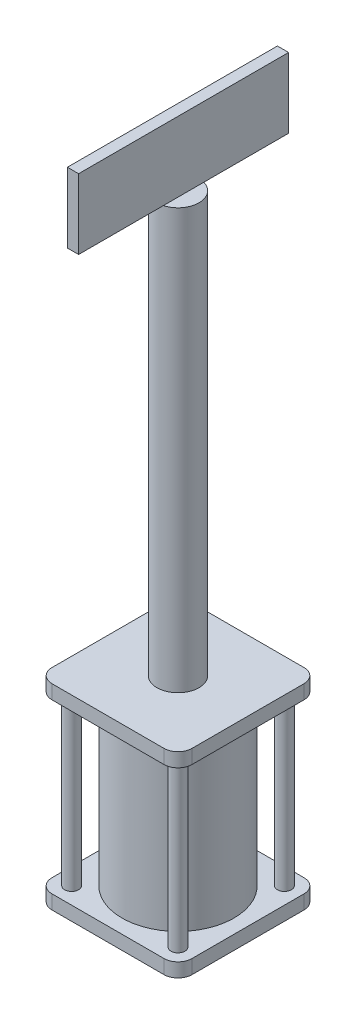
ISO-10303-21;
HEADER;
FILE_DESCRIPTION(('STEP AP214'),'2;1');
FILE_NAME('part.step','',(''),(''),'','','');
FILE_SCHEMA(('AUTOMOTIVE_DESIGN { 1 0 10303 214 1 1 1 1 }'));
ENDSEC;
DATA;
#1=APPLICATION_CONTEXT('core data for automotive mechanical design processes');
#2=APPLICATION_PROTOCOL_DEFINITION('international standard','automotive_design',2000,#1);
#3=PRODUCT_CONTEXT('',#1,'mechanical');
#4=PRODUCT('Part','Part','',(#3));
#5=PRODUCT_RELATED_PRODUCT_CATEGORY('part','',(#4));
#6=PRODUCT_DEFINITION_FORMATION('','',#4);
#7=PRODUCT_DEFINITION_CONTEXT('part definition',#1,'design');
#8=PRODUCT_DEFINITION('design','',#6,#7);
#9=PRODUCT_DEFINITION_SHAPE('','',#8);
#10=(LENGTH_UNIT() NAMED_UNIT(*) SI_UNIT(.MILLI.,.METRE.));
#11=(NAMED_UNIT(*) PLANE_ANGLE_UNIT() SI_UNIT($,.RADIAN.));
#12=(NAMED_UNIT(*) SI_UNIT($,.STERADIAN.) SOLID_ANGLE_UNIT());
#13=UNCERTAINTY_MEASURE_WITH_UNIT(LENGTH_MEASURE(1.E-05),#10,'distance_accuracy_value','');
#14=(GEOMETRIC_REPRESENTATION_CONTEXT(3) GLOBAL_UNCERTAINTY_ASSIGNED_CONTEXT((#13)) GLOBAL_UNIT_ASSIGNED_CONTEXT((#10,
#11,#12)) REPRESENTATION_CONTEXT('',''));
#15=CARTESIAN_POINT('',(0.,0.,0.));
#16=DIRECTION('',(0.,0.,1.));
#17=DIRECTION('',(1.,0.,0.));
#18=AXIS2_PLACEMENT_3D('',#15,#16,#17);
#19=CARTESIAN_POINT('',(4.,490.,75.));
#20=DIRECTION('',(-1.,0.,0.));
#21=DIRECTION('',(0.,0.,1.));
#22=AXIS2_PLACEMENT_3D('',#19,#20,#21);
#23=PLANE('',#22);
#24=DIRECTION('',(0.,0.,-1.));
#25=VECTOR('',#24,1.);
#26=CARTESIAN_POINT('',(4.,440.,75.));
#27=LINE('',#26,#25);
#28=CARTESIAN_POINT('',(4.,440.,75.));
#29=VERTEX_POINT('',#28);
#30=CARTESIAN_POINT('',(4.,440.,-75.));
#31=VERTEX_POINT('',#30);
#32=EDGE_CURVE('E109',#29,#31,#27,.T.);
#33=ORIENTED_EDGE('',*,*,#32,.T.);
#34=DIRECTION('',(0.,-1.,0.));
#35=VECTOR('',#34,1.);
#36=CARTESIAN_POINT('',(4.,490.,-75.));
#37=LINE('',#36,#35);
#38=CARTESIAN_POINT('',(4.,490.,-75.));
#39=VERTEX_POINT('',#38);
#40=EDGE_CURVE('E12',#39,#31,#37,.T.);
#41=ORIENTED_EDGE('',*,*,#40,.F.);
#42=DIRECTION('',(0.,0.,-1.));
#43=VECTOR('',#42,1.);
#44=CARTESIAN_POINT('',(4.,490.,75.));
#45=LINE('',#44,#43);
#46=CARTESIAN_POINT('',(4.,490.,75.));
#47=VERTEX_POINT('',#46);
#48=EDGE_CURVE('E97',#47,#39,#45,.T.);
#49=ORIENTED_EDGE('',*,*,#48,.F.);
#50=DIRECTION('',(0.,-1.,0.));
#51=VECTOR('',#50,1.);
#52=CARTESIAN_POINT('',(4.,490.,75.));
#53=LINE('',#52,#51);
#54=EDGE_CURVE('E105',#47,#29,#53,.T.);
#55=ORIENTED_EDGE('',*,*,#54,.T.);
#56=EDGE_LOOP('',(#33,#41,#49,#55));
#57=FACE_BOUND('',#56,.T.);
#58=ADVANCED_FACE('F46',(#57),#23,.F.);
#59=CARTESIAN_POINT('',(-4.,490.,-75.));
#60=DIRECTION('',(0.,0.,1.));
#61=DIRECTION('',(1.,0.,0.));
#62=AXIS2_PLACEMENT_3D('',#59,#60,#61);
#63=PLANE('',#62);
#64=DIRECTION('',(-1.,0.,0.));
#65=VECTOR('',#64,1.);
#66=CARTESIAN_POINT('',(-4.,440.,-75.));
#67=LINE('',#66,#65);
#68=CARTESIAN_POINT('',(-4.,440.,-75.));
#69=VERTEX_POINT('',#68);
#70=EDGE_CURVE('E101',#31,#69,#67,.T.);
#71=ORIENTED_EDGE('',*,*,#70,.T.);
#72=DIRECTION('',(0.,-1.,0.));
#73=VECTOR('',#72,1.);
#74=CARTESIAN_POINT('',(-4.,490.,-75.));
#75=LINE('',#74,#73);
#76=CARTESIAN_POINT('',(-4.,490.,-75.));
#77=VERTEX_POINT('',#76);
#78=EDGE_CURVE('E54',#77,#69,#75,.T.);
#79=ORIENTED_EDGE('',*,*,#78,.F.);
#80=DIRECTION('',(-1.,0.,0.));
#81=VECTOR('',#80,1.);
#82=CARTESIAN_POINT('',(-4.,490.,-75.));
#83=LINE('',#82,#81);
#84=EDGE_CURVE('E92',#39,#77,#83,.T.);
#85=ORIENTED_EDGE('',*,*,#84,.F.);
#86=ORIENTED_EDGE('',*,*,#40,.T.);
#87=EDGE_LOOP('',(#71,#79,#85,#86));
#88=FACE_BOUND('',#87,.T.);
#89=ADVANCED_FACE('F100',(#88),#63,.F.);
#90=CARTESIAN_POINT('',(-4.,490.,75.));
#91=DIRECTION('',(1.,0.,0.));
#92=DIRECTION('',(0.,0.,-1.));
#93=AXIS2_PLACEMENT_3D('',#90,#91,#92);
#94=PLANE('',#93);
#95=DIRECTION('',(0.,0.,1.));
#96=VECTOR('',#95,1.);
#97=CARTESIAN_POINT('',(-4.,440.,75.));
#98=LINE('',#97,#96);
#99=CARTESIAN_POINT('',(-4.,440.,75.));
#100=VERTEX_POINT('',#99);
#101=EDGE_CURVE('E79',#69,#100,#98,.T.);
#102=ORIENTED_EDGE('',*,*,#101,.T.);
#103=DIRECTION('',(0.,-1.,0.));
#104=VECTOR('',#103,1.);
#105=CARTESIAN_POINT('',(-4.,490.,75.));
#106=LINE('',#105,#104);
#107=CARTESIAN_POINT('',(-4.,490.,75.));
#108=VERTEX_POINT('',#107);
#109=EDGE_CURVE('E102',#108,#100,#106,.T.);
#110=ORIENTED_EDGE('',*,*,#109,.F.);
#111=DIRECTION('',(0.,0.,1.));
#112=VECTOR('',#111,1.);
#113=CARTESIAN_POINT('',(-4.,490.,75.));
#114=LINE('',#113,#112);
#115=EDGE_CURVE('E95',#77,#108,#114,.T.);
#116=ORIENTED_EDGE('',*,*,#115,.F.);
#117=ORIENTED_EDGE('',*,*,#78,.T.);
#118=EDGE_LOOP('',(#102,#110,#116,#117));
#119=FACE_BOUND('',#118,.T.);
#120=ADVANCED_FACE('F103',(#119),#94,.F.);
#121=CARTESIAN_POINT('',(-4.,490.,75.));
#122=DIRECTION('',(0.,0.,-1.));
#123=DIRECTION('',(-1.,0.,0.));
#124=AXIS2_PLACEMENT_3D('',#121,#122,#123);
#125=PLANE('',#124);
#126=DIRECTION('',(1.,0.,0.));
#127=VECTOR('',#126,1.);
#128=CARTESIAN_POINT('',(-4.,440.,75.));
#129=LINE('',#128,#127);
#130=EDGE_CURVE('E85',#100,#29,#129,.T.);
#131=ORIENTED_EDGE('',*,*,#130,.T.);
#132=ORIENTED_EDGE('',*,*,#54,.F.);
#133=DIRECTION('',(1.,0.,0.));
#134=VECTOR('',#133,1.);
#135=CARTESIAN_POINT('',(-4.,490.,75.));
#136=LINE('',#135,#134);
#137=EDGE_CURVE('E62',#108,#47,#136,.T.);
#138=ORIENTED_EDGE('',*,*,#137,.F.);
#139=ORIENTED_EDGE('',*,*,#109,.T.);
#140=EDGE_LOOP('',(#131,#132,#138,#139));
#141=FACE_BOUND('',#140,.T.);
#142=ADVANCED_FACE('F116',(#141),#125,.F.);
#143=CARTESIAN_POINT('',(0.,490.,0.));
#144=DIRECTION('',(0.,-1.,0.));
#145=DIRECTION('',(0.,0.,-1.));
#146=AXIS2_PLACEMENT_3D('',#143,#144,#145);
#147=PLANE('',#146);
#148=ORIENTED_EDGE('',*,*,#48,.T.);
#149=ORIENTED_EDGE('',*,*,#84,.T.);
#150=ORIENTED_EDGE('',*,*,#115,.T.);
#151=ORIENTED_EDGE('',*,*,#137,.T.);
#152=EDGE_LOOP('',(#148,#149,#150,#151));
#153=FACE_BOUND('',#152,.T.);
#154=ADVANCED_FACE('F93',(#153),#147,.F.);
#155=CARTESIAN_POINT('',(0.,440.,0.));
#156=DIRECTION('',(0.,-1.,0.));
#157=DIRECTION('',(0.,0.,-1.));
#158=AXIS2_PLACEMENT_3D('',#155,#156,#157);
#159=PLANE('',#158);
#160=ORIENTED_EDGE('',*,*,#32,.F.);
#161=ORIENTED_EDGE('',*,*,#130,.F.);
#162=ORIENTED_EDGE('',*,*,#101,.F.);
#163=ORIENTED_EDGE('',*,*,#70,.F.);
#164=EDGE_LOOP('',(#160,#161,#162,#163));
#165=FACE_BOUND('',#164,.T.);
#166=ADVANCED_FACE('F119',(#165),#159,.T.);
#167=CLOSED_SHELL('',(#58,#89,#120,#142,#154,#166));
#168=MANIFOLD_SOLID_BREP('B2',#167);
#169=CARTESIAN_POINT('',(0.,440.,0.));
#170=DIRECTION('',(0.,-1.,0.));
#171=DIRECTION('',(0.,0.,-1.));
#172=AXIS2_PLACEMENT_3D('',#169,#170,#171);
#173=CYLINDRICAL_SURFACE('',#172,15.);
#174=CARTESIAN_POINT('',(0.,440.,0.));
#175=DIRECTION('',(0.,1.,0.));
#176=DIRECTION('',(0.,0.,1.));
#177=AXIS2_PLACEMENT_3D('',#174,#175,#176);
#178=CIRCLE('',#177,15.);
#179=CARTESIAN_POINT('',(0.,440.,15.));
#180=VERTEX_POINT('',#179);
#181=EDGE_CURVE('E45',#180,#180,#178,.T.);
#182=ORIENTED_EDGE('',*,*,#181,.F.);
#183=EDGE_LOOP('',(#182));
#184=FACE_BOUND('',#183,.T.);
#185=CARTESIAN_POINT('',(0.,140.,0.));
#186=DIRECTION('',(0.,1.,0.));
#187=DIRECTION('',(0.,0.,1.));
#188=AXIS2_PLACEMENT_3D('',#185,#186,#187);
#189=CIRCLE('',#188,15.);
#190=CARTESIAN_POINT('',(0.,140.,15.));
#191=VERTEX_POINT('',#190);
#192=EDGE_CURVE('E182',#191,#191,#189,.T.);
#193=ORIENTED_EDGE('',*,*,#192,.T.);
#194=EDGE_LOOP('',(#193));
#195=FACE_BOUND('',#194,.T.);
#196=ADVANCED_FACE('F179',(#184,#195),#173,.T.);
#197=CARTESIAN_POINT('',(0.,440.,0.));
#198=DIRECTION('',(0.,1.,0.));
#199=DIRECTION('',(0.,0.,1.));
#200=AXIS2_PLACEMENT_3D('',#197,#198,#199);
#201=PLANE('',#200);
#202=ORIENTED_EDGE('',*,*,#181,.T.);
#203=EDGE_LOOP('',(#202));
#204=FACE_BOUND('',#203,.T.);
#205=ADVANCED_FACE('F194',(#204),#201,.T.);
#206=CARTESIAN_POINT('',(0.,140.,0.));
#207=DIRECTION('',(0.,1.,0.));
#208=DIRECTION('',(0.,0.,1.));
#209=AXIS2_PLACEMENT_3D('',#206,#207,#208);
#210=PLANE('',#209);
#211=ORIENTED_EDGE('',*,*,#192,.F.);
#212=EDGE_LOOP('',(#211));
#213=FACE_BOUND('',#212,.T.);
#214=ADVANCED_FACE('F192',(#213),#210,.F.);
#215=CLOSED_SHELL('',(#196,#205,#214));
#216=MANIFOLD_SOLID_BREP('B6',#215);
#217=CARTESIAN_POINT('',(50.,10.,50.));
#218=DIRECTION('',(-1.,0.,0.));
#219=DIRECTION('',(0.,0.,1.));
#220=AXIS2_PLACEMENT_3D('',#217,#218,#219);
#221=PLANE('',#220);
#222=DIRECTION('',(0.,0.,-1.));
#223=VECTOR('',#222,1.);
#224=CARTESIAN_POINT('',(50.,0.,50.));
#225=LINE('',#224,#223);
#226=CARTESIAN_POINT('',(50.,0.,40.));
#227=VERTEX_POINT('',#226);
#228=CARTESIAN_POINT('',(50.,0.,-40.));
#229=VERTEX_POINT('',#228);
#230=EDGE_CURVE('E361',#227,#229,#225,.T.);
#231=ORIENTED_EDGE('',*,*,#230,.T.);
#232=DIRECTION('',(0.,-1.,0.));
#233=VECTOR('',#232,1.);
#234=CARTESIAN_POINT('',(50.,10.,-40.));
#235=LINE('',#234,#233);
#236=CARTESIAN_POINT('',(50.,10.,-40.));
#237=VERTEX_POINT('',#236);
#238=EDGE_CURVE('E339',#229,#237,#235,.F.);
#239=ORIENTED_EDGE('',*,*,#238,.T.);
#240=DIRECTION('',(0.,0.,-1.));
#241=VECTOR('',#240,1.);
#242=CARTESIAN_POINT('',(50.,10.,50.));
#243=LINE('',#242,#241);
#244=CARTESIAN_POINT('',(50.,10.,40.));
#245=VERTEX_POINT('',#244);
#246=EDGE_CURVE('E372',#245,#237,#243,.T.);
#247=ORIENTED_EDGE('',*,*,#246,.F.);
#248=DIRECTION('',(0.,-1.,0.));
#249=VECTOR('',#248,1.);
#250=CARTESIAN_POINT('',(50.,10.,40.));
#251=LINE('',#250,#249);
#252=EDGE_CURVE('E344',#245,#227,#251,.T.);
#253=ORIENTED_EDGE('',*,*,#252,.T.);
#254=EDGE_LOOP('',(#231,#239,#247,#253));
#255=FACE_BOUND('',#254,.T.);
#256=ADVANCED_FACE('F220',(#255),#221,.F.);
#257=CARTESIAN_POINT('',(-50.,10.,-50.));
#258=DIRECTION('',(0.,0.,1.));
#259=DIRECTION('',(1.,0.,0.));
#260=AXIS2_PLACEMENT_3D('',#257,#258,#259);
#261=PLANE('',#260);
#262=DIRECTION('',(-1.,0.,0.));
#263=VECTOR('',#262,1.);
#264=CARTESIAN_POINT('',(-50.,10.,-50.));
#265=LINE('',#264,#263);
#266=CARTESIAN_POINT('',(40.,10.,-50.));
#267=VERTEX_POINT('',#266);
#268=CARTESIAN_POINT('',(-40.,10.,-50.));
#269=VERTEX_POINT('',#268);
#270=EDGE_CURVE('E354',#267,#269,#265,.T.);
#271=ORIENTED_EDGE('',*,*,#270,.F.);
#272=DIRECTION('',(0.,-1.,0.));
#273=VECTOR('',#272,1.);
#274=CARTESIAN_POINT('',(40.,10.,-50.));
#275=LINE('',#274,#273);
#276=CARTESIAN_POINT('',(40.,0.,-50.));
#277=VERTEX_POINT('',#276);
#278=EDGE_CURVE('E338',#267,#277,#275,.T.);
#279=ORIENTED_EDGE('',*,*,#278,.T.);
#280=DIRECTION('',(-1.,0.,0.));
#281=VECTOR('',#280,1.);
#282=CARTESIAN_POINT('',(-50.,0.,-50.));
#283=LINE('',#282,#281);
#284=CARTESIAN_POINT('',(-40.,0.,-50.));
#285=VERTEX_POINT('',#284);
#286=EDGE_CURVE('E351',#277,#285,#283,.T.);
#287=ORIENTED_EDGE('',*,*,#286,.T.);
#288=DIRECTION('',(0.,-1.,0.));
#289=VECTOR('',#288,1.);
#290=CARTESIAN_POINT('',(-40.,10.,-50.));
#291=LINE('',#290,#289);
#292=EDGE_CURVE('E356',#285,#269,#291,.F.);
#293=ORIENTED_EDGE('',*,*,#292,.T.);
#294=EDGE_LOOP('',(#271,#279,#287,#293));
#295=FACE_BOUND('',#294,.T.);
#296=ADVANCED_FACE('F350',(#295),#261,.F.);
#297=CARTESIAN_POINT('',(-50.,10.,50.));
#298=DIRECTION('',(1.,0.,0.));
#299=DIRECTION('',(0.,0.,-1.));
#300=AXIS2_PLACEMENT_3D('',#297,#298,#299);
#301=PLANE('',#300);
#302=DIRECTION('',(0.,0.,1.));
#303=VECTOR('',#302,1.);
#304=CARTESIAN_POINT('',(-50.,0.,50.));
#305=LINE('',#304,#303);
#306=CARTESIAN_POINT('',(-50.,0.,-40.));
#307=VERTEX_POINT('',#306);
#308=CARTESIAN_POINT('',(-50.,0.,40.));
#309=VERTEX_POINT('',#308);
#310=EDGE_CURVE('E360',#307,#309,#305,.T.);
#311=ORIENTED_EDGE('',*,*,#310,.T.);
#312=DIRECTION('',(0.,-1.,0.));
#313=VECTOR('',#312,1.);
#314=CARTESIAN_POINT('',(-50.,10.,40.));
#315=LINE('',#314,#313);
#316=CARTESIAN_POINT('',(-50.,10.,40.));
#317=VERTEX_POINT('',#316);
#318=EDGE_CURVE('E422',#309,#317,#315,.F.);
#319=ORIENTED_EDGE('',*,*,#318,.T.);
#320=DIRECTION('',(0.,0.,1.));
#321=VECTOR('',#320,1.);
#322=CARTESIAN_POINT('',(-50.,10.,50.));
#323=LINE('',#322,#321);
#324=CARTESIAN_POINT('',(-50.,10.,-40.));
#325=VERTEX_POINT('',#324);
#326=EDGE_CURVE('E489',#325,#317,#323,.T.);
#327=ORIENTED_EDGE('',*,*,#326,.F.);
#328=DIRECTION('',(0.,-1.,0.));
#329=VECTOR('',#328,1.);
#330=CARTESIAN_POINT('',(-50.,10.,-40.));
#331=LINE('',#330,#329);
#332=EDGE_CURVE('E419',#325,#307,#331,.T.);
#333=ORIENTED_EDGE('',*,*,#332,.T.);
#334=EDGE_LOOP('',(#311,#319,#327,#333));
#335=FACE_BOUND('',#334,.T.);
#336=ADVANCED_FACE('F511',(#335),#301,.F.);
#337=CARTESIAN_POINT('',(-50.,10.,50.));
#338=DIRECTION('',(0.,0.,-1.));
#339=DIRECTION('',(-1.,0.,0.));
#340=AXIS2_PLACEMENT_3D('',#337,#338,#339);
#341=PLANE('',#340);
#342=DIRECTION('',(1.,0.,0.));
#343=VECTOR('',#342,1.);
#344=CARTESIAN_POINT('',(-50.,0.,50.));
#345=LINE('',#344,#343);
#346=CARTESIAN_POINT('',(-40.,0.,50.));
#347=VERTEX_POINT('',#346);
#348=CARTESIAN_POINT('',(40.,0.,50.));
#349=VERTEX_POINT('',#348);
#350=EDGE_CURVE('E364',#347,#349,#345,.T.);
#351=ORIENTED_EDGE('',*,*,#350,.T.);
#352=DIRECTION('',(0.,-1.,0.));
#353=VECTOR('',#352,1.);
#354=CARTESIAN_POINT('',(40.,10.,50.));
#355=LINE('',#354,#353);
#356=CARTESIAN_POINT('',(40.,10.,50.));
#357=VERTEX_POINT('',#356);
#358=EDGE_CURVE('E417',#349,#357,#355,.F.);
#359=ORIENTED_EDGE('',*,*,#358,.T.);
#360=DIRECTION('',(1.,0.,0.));
#361=VECTOR('',#360,1.);
#362=CARTESIAN_POINT('',(-50.,10.,50.));
#363=LINE('',#362,#361);
#364=CARTESIAN_POINT('',(-40.,10.,50.));
#365=VERTEX_POINT('',#364);
#366=EDGE_CURVE('E377',#365,#357,#363,.T.);
#367=ORIENTED_EDGE('',*,*,#366,.F.);
#368=DIRECTION('',(0.,-1.,0.));
#369=VECTOR('',#368,1.);
#370=CARTESIAN_POINT('',(-40.,10.,50.));
#371=LINE('',#370,#369);
#372=EDGE_CURVE('E414',#365,#347,#371,.T.);
#373=ORIENTED_EDGE('',*,*,#372,.T.);
#374=EDGE_LOOP('',(#351,#359,#367,#373));
#375=FACE_BOUND('',#374,.T.);
#376=ADVANCED_FACE('F506',(#375),#341,.F.);
#377=CARTESIAN_POINT('',(0.,10.,0.));
#378=DIRECTION('',(0.,-1.,0.));
#379=DIRECTION('',(0.,0.,-1.));
#380=AXIS2_PLACEMENT_3D('',#377,#378,#379);
#381=PLANE('',#380);
#382=CARTESIAN_POINT('',(-38.,10.,38.));
#383=DIRECTION('',(0.,-1.,0.));
#384=DIRECTION('',(0.,0.,-1.));
#385=AXIS2_PLACEMENT_3D('',#382,#383,#384);
#386=CIRCLE('',#385,5.);
#387=CARTESIAN_POINT('',(-38.,10.,33.));
#388=VERTEX_POINT('',#387);
#389=EDGE_CURVE('E395',#388,#388,#386,.F.);
#390=ORIENTED_EDGE('',*,*,#389,.F.);
#391=EDGE_LOOP('',(#390));
#392=FACE_BOUND('',#391,.T.);
#393=CARTESIAN_POINT('',(38.,10.,38.));
#394=DIRECTION('',(0.,-1.,0.));
#395=DIRECTION('',(0.,0.,-1.));
#396=AXIS2_PLACEMENT_3D('',#393,#394,#395);
#397=CIRCLE('',#396,5.);
#398=CARTESIAN_POINT('',(38.,10.,33.));
#399=VERTEX_POINT('',#398);
#400=EDGE_CURVE('E389',#399,#399,#397,.F.);
#401=ORIENTED_EDGE('',*,*,#400,.F.);
#402=EDGE_LOOP('',(#401));
#403=FACE_BOUND('',#402,.T.);
#404=CARTESIAN_POINT('',(38.,10.,-38.));
#405=DIRECTION('',(0.,-1.,0.));
#406=DIRECTION('',(0.,0.,-1.));
#407=AXIS2_PLACEMENT_3D('',#404,#405,#406);
#408=CIRCLE('',#407,5.);
#409=CARTESIAN_POINT('',(38.,10.,-43.));
#410=VERTEX_POINT('',#409);
#411=EDGE_CURVE('E383',#410,#410,#408,.F.);
#412=ORIENTED_EDGE('',*,*,#411,.F.);
#413=EDGE_LOOP('',(#412));
#414=FACE_BOUND('',#413,.T.);
#415=CARTESIAN_POINT('',(0.,9.99999999999999,0.));
#416=DIRECTION('',(0.,-1.,0.));
#417=DIRECTION('',(0.,0.,-1.));
#418=AXIS2_PLACEMENT_3D('',#415,#416,#417);
#419=CIRCLE('',#418,40.);
#420=CARTESIAN_POINT('',(0.,9.99999999999999,-40.));
#421=VERTEX_POINT('',#420);
#422=EDGE_CURVE('E376',#421,#421,#419,.F.);
#423=ORIENTED_EDGE('',*,*,#422,.F.);
#424=EDGE_LOOP('',(#423));
#425=FACE_BOUND('',#424,.T.);
#426=CARTESIAN_POINT('',(-38.,10.,-38.));
#427=DIRECTION('',(0.,-1.,0.));
#428=DIRECTION('',(0.,0.,-1.));
#429=AXIS2_PLACEMENT_3D('',#426,#427,#428);
#430=CIRCLE('',#429,5.);
#431=CARTESIAN_POINT('',(-38.,10.,-43.));
#432=VERTEX_POINT('',#431);
#433=EDGE_CURVE('E373',#432,#432,#430,.F.);
#434=ORIENTED_EDGE('',*,*,#433,.F.);
#435=EDGE_LOOP('',(#434));
#436=FACE_BOUND('',#435,.T.);
#437=ORIENTED_EDGE('',*,*,#246,.T.);
#438=CARTESIAN_POINT('',(40.,10.,-40.));
#439=DIRECTION('',(0.,-1.,0.));
#440=DIRECTION('',(0.,0.,-1.));
#441=AXIS2_PLACEMENT_3D('',#438,#439,#440);
#442=CIRCLE('',#441,10.);
#443=EDGE_CURVE('E412',#237,#267,#442,.F.);
#444=ORIENTED_EDGE('',*,*,#443,.T.);
#445=ORIENTED_EDGE('',*,*,#270,.T.);
#446=CARTESIAN_POINT('',(-40.,10.,-40.));
#447=DIRECTION('',(0.,-1.,0.));
#448=DIRECTION('',(0.,0.,-1.));
#449=AXIS2_PLACEMENT_3D('',#446,#447,#448);
#450=CIRCLE('',#449,10.);
#451=EDGE_CURVE('E406',#269,#325,#450,.F.);
#452=ORIENTED_EDGE('',*,*,#451,.T.);
#453=ORIENTED_EDGE('',*,*,#326,.T.);
#454=CARTESIAN_POINT('',(-40.,10.,40.));
#455=DIRECTION('',(0.,-1.,0.));
#456=DIRECTION('',(0.,0.,-1.));
#457=AXIS2_PLACEMENT_3D('',#454,#455,#456);
#458=CIRCLE('',#457,10.);
#459=EDGE_CURVE('E408',#317,#365,#458,.F.);
#460=ORIENTED_EDGE('',*,*,#459,.T.);
#461=ORIENTED_EDGE('',*,*,#366,.T.);
#462=CARTESIAN_POINT('',(40.,10.,40.));
#463=DIRECTION('',(0.,-1.,0.));
#464=DIRECTION('',(0.,0.,-1.));
#465=AXIS2_PLACEMENT_3D('',#462,#463,#464);
#466=CIRCLE('',#465,10.);
#467=EDGE_CURVE('E410',#357,#245,#466,.F.);
#468=ORIENTED_EDGE('',*,*,#467,.T.);
#469=EDGE_LOOP('',(#437,#444,#445,#452,#453,#460,#461,#468));
#470=FACE_BOUND('',#469,.T.);
#471=ADVANCED_FACE('F495',(#392,#403,#414,#425,#436,#470),#381,.F.);
#472=CARTESIAN_POINT('',(0.,0.,0.));
#473=DIRECTION('',(0.,-1.,0.));
#474=DIRECTION('',(0.,0.,-1.));
#475=AXIS2_PLACEMENT_3D('',#472,#473,#474);
#476=PLANE('',#475);
#477=ORIENTED_EDGE('',*,*,#286,.F.);
#478=CARTESIAN_POINT('',(40.,0.,-40.));
#479=DIRECTION('',(0.,-1.,0.));
#480=DIRECTION('',(0.,0.,-1.));
#481=AXIS2_PLACEMENT_3D('',#478,#479,#480);
#482=CIRCLE('',#481,10.);
#483=EDGE_CURVE('E334',#277,#229,#482,.T.);
#484=ORIENTED_EDGE('',*,*,#483,.T.);
#485=ORIENTED_EDGE('',*,*,#230,.F.);
#486=CARTESIAN_POINT('',(40.,0.,40.));
#487=DIRECTION('',(0.,-1.,0.));
#488=DIRECTION('',(0.,0.,-1.));
#489=AXIS2_PLACEMENT_3D('',#486,#487,#488);
#490=CIRCLE('',#489,10.);
#491=EDGE_CURVE('E345',#227,#349,#490,.T.);
#492=ORIENTED_EDGE('',*,*,#491,.T.);
#493=ORIENTED_EDGE('',*,*,#350,.F.);
#494=CARTESIAN_POINT('',(-40.,0.,40.));
#495=DIRECTION('',(0.,-1.,0.));
#496=DIRECTION('',(0.,0.,-1.));
#497=AXIS2_PLACEMENT_3D('',#494,#495,#496);
#498=CIRCLE('',#497,10.);
#499=EDGE_CURVE('E400',#347,#309,#498,.T.);
#500=ORIENTED_EDGE('',*,*,#499,.T.);
#501=ORIENTED_EDGE('',*,*,#310,.F.);
#502=CARTESIAN_POINT('',(-40.,0.,-40.));
#503=DIRECTION('',(0.,-1.,0.));
#504=DIRECTION('',(0.,0.,-1.));
#505=AXIS2_PLACEMENT_3D('',#502,#503,#504);
#506=CIRCLE('',#505,10.);
#507=EDGE_CURVE('E355',#307,#285,#506,.T.);
#508=ORIENTED_EDGE('',*,*,#507,.T.);
#509=EDGE_LOOP('',(#477,#484,#485,#492,#493,#500,#501,#508));
#510=FACE_BOUND('',#509,.T.);
#511=ADVANCED_FACE('F358',(#510),#476,.T.);
#512=CARTESIAN_POINT('',(-38.,144.142135623731,-38.));
#513=DIRECTION('',(0.,-1.,0.));
#514=DIRECTION('',(0.,0.,-1.));
#515=AXIS2_PLACEMENT_3D('',#512,#513,#514);
#516=CYLINDRICAL_SURFACE('',#515,5.);
#517=ORIENTED_EDGE('',*,*,#433,.T.);
#518=EDGE_LOOP('',(#517));
#519=FACE_BOUND('',#518,.T.);
#520=CARTESIAN_POINT('',(-38.,130.,-38.));
#521=DIRECTION('',(0.,1.,0.));
#522=DIRECTION('',(0.,0.,1.));
#523=AXIS2_PLACEMENT_3D('',#520,#521,#522);
#524=CIRCLE('',#523,5.);
#525=CARTESIAN_POINT('',(-38.,130.,-33.));
#526=VERTEX_POINT('',#525);
#527=EDGE_CURVE('E366',#526,#526,#524,.T.);
#528=ORIENTED_EDGE('',*,*,#527,.F.);
#529=EDGE_LOOP('',(#528));
#530=FACE_BOUND('',#529,.T.);
#531=ADVANCED_FACE('F625',(#519,#530),#516,.T.);
#532=CARTESIAN_POINT('',(0.,130.,0.));
#533=DIRECTION('',(0.,-1.,0.));
#534=DIRECTION('',(0.,0.,-1.));
#535=AXIS2_PLACEMENT_3D('',#532,#533,#534);
#536=CYLINDRICAL_SURFACE('',#535,40.);
#537=CARTESIAN_POINT('',(0.,130.,0.));
#538=DIRECTION('',(0.,1.,0.));
#539=DIRECTION('',(0.,0.,1.));
#540=AXIS2_PLACEMENT_3D('',#537,#538,#539);
#541=CIRCLE('',#540,40.);
#542=CARTESIAN_POINT('',(0.,130.,40.));
#543=VERTEX_POINT('',#542);
#544=EDGE_CURVE('E480',#543,#543,#541,.T.);
#545=ORIENTED_EDGE('',*,*,#544,.F.);
#546=EDGE_LOOP('',(#545));
#547=FACE_BOUND('',#546,.T.);
#548=ORIENTED_EDGE('',*,*,#422,.T.);
#549=EDGE_LOOP('',(#548));
#550=FACE_BOUND('',#549,.T.);
#551=ADVANCED_FACE('F622',(#547,#550),#536,.T.);
#552=CARTESIAN_POINT('',(-50.,140.,-50.));
#553=DIRECTION('',(1.,0.,0.));
#554=DIRECTION('',(0.,0.,-1.));
#555=AXIS2_PLACEMENT_3D('',#552,#553,#554);
#556=PLANE('',#555);
#557=DIRECTION('',(0.,0.,1.));
#558=VECTOR('',#557,1.);
#559=CARTESIAN_POINT('',(-50.,140.,-50.));
#560=LINE('',#559,#558);
#561=CARTESIAN_POINT('',(-50.,140.,-40.));
#562=VERTEX_POINT('',#561);
#563=CARTESIAN_POINT('',(-50.,140.,40.));
#564=VERTEX_POINT('',#563);
#565=EDGE_CURVE('E479',#562,#564,#560,.T.);
#566=ORIENTED_EDGE('',*,*,#565,.F.);
#567=DIRECTION('',(0.,-1.,0.));
#568=VECTOR('',#567,1.);
#569=CARTESIAN_POINT('',(-50.,140.,-40.));
#570=LINE('',#569,#568);
#571=CARTESIAN_POINT('',(-50.,130.,-40.));
#572=VERTEX_POINT('',#571);
#573=EDGE_CURVE('E426',#562,#572,#570,.T.);
#574=ORIENTED_EDGE('',*,*,#573,.T.);
#575=DIRECTION('',(0.,0.,1.));
#576=VECTOR('',#575,1.);
#577=CARTESIAN_POINT('',(-50.,130.,-50.));
#578=LINE('',#577,#576);
#579=CARTESIAN_POINT('',(-50.,130.,40.));
#580=VERTEX_POINT('',#579);
#581=EDGE_CURVE('E470',#572,#580,#578,.T.);
#582=ORIENTED_EDGE('',*,*,#581,.T.);
#583=DIRECTION('',(0.,-1.,0.));
#584=VECTOR('',#583,1.);
#585=CARTESIAN_POINT('',(-50.,140.,40.));
#586=LINE('',#585,#584);
#587=EDGE_CURVE('E424',#580,#564,#586,.F.);
#588=ORIENTED_EDGE('',*,*,#587,.T.);
#589=EDGE_LOOP('',(#566,#574,#582,#588));
#590=FACE_BOUND('',#589,.T.);
#591=ADVANCED_FACE('F605',(#590),#556,.F.);
#592=CARTESIAN_POINT('',(-50.,140.,50.));
#593=DIRECTION('',(0.,0.,-1.));
#594=DIRECTION('',(-1.,0.,0.));
#595=AXIS2_PLACEMENT_3D('',#592,#593,#594);
#596=PLANE('',#595);
#597=DIRECTION('',(1.,0.,0.));
#598=VECTOR('',#597,1.);
#599=CARTESIAN_POINT('',(-50.,130.,50.));
#600=LINE('',#599,#598);
#601=CARTESIAN_POINT('',(-40.,130.,50.));
#602=VERTEX_POINT('',#601);
#603=CARTESIAN_POINT('',(40.,130.,50.));
#604=VERTEX_POINT('',#603);
#605=EDGE_CURVE('E459',#602,#604,#600,.T.);
#606=ORIENTED_EDGE('',*,*,#605,.T.);
#607=DIRECTION('',(0.,-1.,0.));
#608=VECTOR('',#607,1.);
#609=CARTESIAN_POINT('',(40.,140.,50.));
#610=LINE('',#609,#608);
#611=CARTESIAN_POINT('',(40.,140.,50.));
#612=VERTEX_POINT('',#611);
#613=EDGE_CURVE('E177',#604,#612,#610,.F.);
#614=ORIENTED_EDGE('',*,*,#613,.T.);
#615=DIRECTION('',(1.,0.,0.));
#616=VECTOR('',#615,1.);
#617=CARTESIAN_POINT('',(-50.,140.,50.));
#618=LINE('',#617,#616);
#619=CARTESIAN_POINT('',(-40.,140.,50.));
#620=VERTEX_POINT('',#619);
#621=EDGE_CURVE('E461',#620,#612,#618,.T.);
#622=ORIENTED_EDGE('',*,*,#621,.F.);
#623=DIRECTION('',(0.,-1.,0.));
#624=VECTOR('',#623,1.);
#625=CARTESIAN_POINT('',(-40.,140.,50.));
#626=LINE('',#625,#624);
#627=EDGE_CURVE('E228',#620,#602,#626,.T.);
#628=ORIENTED_EDGE('',*,*,#627,.T.);
#629=EDGE_LOOP('',(#606,#614,#622,#628));
#630=FACE_BOUND('',#629,.T.);
#631=ADVANCED_FACE('F458',(#630),#596,.F.);
#632=CARTESIAN_POINT('',(50.,140.,-50.));
#633=DIRECTION('',(-1.,0.,0.));
#634=DIRECTION('',(0.,0.,1.));
#635=AXIS2_PLACEMENT_3D('',#632,#633,#634);
#636=PLANE('',#635);
#637=DIRECTION('',(0.,0.,-1.));
#638=VECTOR('',#637,1.);
#639=CARTESIAN_POINT('',(50.,130.,-50.));
#640=LINE('',#639,#638);
#641=CARTESIAN_POINT('',(50.,130.,40.));
#642=VERTEX_POINT('',#641);
#643=CARTESIAN_POINT('',(50.,130.,-40.));
#644=VERTEX_POINT('',#643);
#645=EDGE_CURVE('E469',#642,#644,#640,.T.);
#646=ORIENTED_EDGE('',*,*,#645,.T.);
#647=DIRECTION('',(0.,-1.,0.));
#648=VECTOR('',#647,1.);
#649=CARTESIAN_POINT('',(50.,140.,-40.));
#650=LINE('',#649,#648);
#651=CARTESIAN_POINT('',(50.,140.,-40.));
#652=VERTEX_POINT('',#651);
#653=EDGE_CURVE('E235',#644,#652,#650,.F.);
#654=ORIENTED_EDGE('',*,*,#653,.T.);
#655=DIRECTION('',(0.,0.,-1.));
#656=VECTOR('',#655,1.);
#657=CARTESIAN_POINT('',(50.,140.,-50.));
#658=LINE('',#657,#656);
#659=CARTESIAN_POINT('',(50.,140.,40.));
#660=VERTEX_POINT('',#659);
#661=EDGE_CURVE('E597',#660,#652,#658,.T.);
#662=ORIENTED_EDGE('',*,*,#661,.F.);
#663=DIRECTION('',(0.,-1.,0.));
#664=VECTOR('',#663,1.);
#665=CARTESIAN_POINT('',(50.,140.,40.));
#666=LINE('',#665,#664);
#667=EDGE_CURVE('E449',#660,#642,#666,.T.);
#668=ORIENTED_EDGE('',*,*,#667,.T.);
#669=EDGE_LOOP('',(#646,#654,#662,#668));
#670=FACE_BOUND('',#669,.T.);
#671=ADVANCED_FACE('F608',(#670),#636,.F.);
#672=CARTESIAN_POINT('',(-50.,140.,-50.));
#673=DIRECTION('',(0.,0.,1.));
#674=DIRECTION('',(1.,0.,0.));
#675=AXIS2_PLACEMENT_3D('',#672,#673,#674);
#676=PLANE('',#675);
#677=DIRECTION('',(-1.,0.,0.));
#678=VECTOR('',#677,1.);
#679=CARTESIAN_POINT('',(-50.,130.,-50.));
#680=LINE('',#679,#678);
#681=CARTESIAN_POINT('',(40.,130.,-50.));
#682=VERTEX_POINT('',#681);
#683=CARTESIAN_POINT('',(-40.,130.,-50.));
#684=VERTEX_POINT('',#683);
#685=EDGE_CURVE('E472',#682,#684,#680,.T.);
#686=ORIENTED_EDGE('',*,*,#685,.T.);
#687=DIRECTION('',(0.,-1.,0.));
#688=VECTOR('',#687,1.);
#689=CARTESIAN_POINT('',(-40.,140.,-50.));
#690=LINE('',#689,#688);
#691=CARTESIAN_POINT('',(-40.,140.,-50.));
#692=VERTEX_POINT('',#691);
#693=EDGE_CURVE('E440',#684,#692,#690,.F.);
#694=ORIENTED_EDGE('',*,*,#693,.T.);
#695=DIRECTION('',(-1.,0.,0.));
#696=VECTOR('',#695,1.);
#697=CARTESIAN_POINT('',(-50.,140.,-50.));
#698=LINE('',#697,#696);
#699=CARTESIAN_POINT('',(40.,140.,-50.));
#700=VERTEX_POINT('',#699);
#701=EDGE_CURVE('E483',#700,#692,#698,.T.);
#702=ORIENTED_EDGE('',*,*,#701,.F.);
#703=DIRECTION('',(0.,-1.,0.));
#704=VECTOR('',#703,1.);
#705=CARTESIAN_POINT('',(40.,140.,-50.));
#706=LINE('',#705,#704);
#707=EDGE_CURVE('E437',#700,#682,#706,.T.);
#708=ORIENTED_EDGE('',*,*,#707,.T.);
#709=EDGE_LOOP('',(#686,#694,#702,#708));
#710=FACE_BOUND('',#709,.T.);
#711=ADVANCED_FACE('F607',(#710),#676,.F.);
#712=CARTESIAN_POINT('',(0.,140.,0.));
#713=DIRECTION('',(0.,1.,0.));
#714=DIRECTION('',(0.,0.,1.));
#715=AXIS2_PLACEMENT_3D('',#712,#713,#714);
#716=PLANE('',#715);
#717=ORIENTED_EDGE('',*,*,#701,.T.);
#718=CARTESIAN_POINT('',(-40.,140.,-40.));
#719=DIRECTION('',(0.,1.,0.));
#720=DIRECTION('',(0.,0.,1.));
#721=AXIS2_PLACEMENT_3D('',#718,#719,#720);
#722=CIRCLE('',#721,10.);
#723=EDGE_CURVE('E447',#692,#562,#722,.T.);
#724=ORIENTED_EDGE('',*,*,#723,.T.);
#725=ORIENTED_EDGE('',*,*,#565,.T.);
#726=CARTESIAN_POINT('',(-40.,140.,40.));
#727=DIRECTION('',(0.,1.,0.));
#728=DIRECTION('',(0.,0.,1.));
#729=AXIS2_PLACEMENT_3D('',#726,#727,#728);
#730=CIRCLE('',#729,10.);
#731=EDGE_CURVE('E442',#564,#620,#730,.T.);
#732=ORIENTED_EDGE('',*,*,#731,.T.);
#733=ORIENTED_EDGE('',*,*,#621,.T.);
#734=CARTESIAN_POINT('',(40.,140.,40.));
#735=DIRECTION('',(0.,1.,0.));
#736=DIRECTION('',(0.,0.,1.));
#737=AXIS2_PLACEMENT_3D('',#734,#735,#736);
#738=CIRCLE('',#737,10.);
#739=EDGE_CURVE('E242',#612,#660,#738,.T.);
#740=ORIENTED_EDGE('',*,*,#739,.T.);
#741=ORIENTED_EDGE('',*,*,#661,.T.);
#742=CARTESIAN_POINT('',(40.,140.,-40.));
#743=DIRECTION('',(0.,1.,0.));
#744=DIRECTION('',(0.,0.,1.));
#745=AXIS2_PLACEMENT_3D('',#742,#743,#744);
#746=CIRCLE('',#745,10.);
#747=EDGE_CURVE('E445',#652,#700,#746,.T.);
#748=ORIENTED_EDGE('',*,*,#747,.T.);
#749=EDGE_LOOP('',(#717,#724,#725,#732,#733,#740,#741,#748));
#750=FACE_BOUND('',#749,.T.);
#751=ADVANCED_FACE('F591',(#750),#716,.T.);
#752=CARTESIAN_POINT('',(0.,130.,0.));
#753=DIRECTION('',(0.,1.,0.));
#754=DIRECTION('',(0.,0.,1.));
#755=AXIS2_PLACEMENT_3D('',#752,#753,#754);
#756=PLANE('',#755);
#757=CARTESIAN_POINT('',(-38.,130.,38.));
#758=DIRECTION('',(0.,1.,0.));
#759=DIRECTION('',(0.,0.,1.));
#760=AXIS2_PLACEMENT_3D('',#757,#758,#759);
#761=CIRCLE('',#760,5.);
#762=CARTESIAN_POINT('',(-38.,130.,43.));
#763=VERTEX_POINT('',#762);
#764=EDGE_CURVE('E392',#763,#763,#761,.F.);
#765=ORIENTED_EDGE('',*,*,#764,.F.);
#766=EDGE_LOOP('',(#765));
#767=FACE_BOUND('',#766,.T.);
#768=CARTESIAN_POINT('',(38.,130.,38.));
#769=DIRECTION('',(0.,1.,0.));
#770=DIRECTION('',(0.,0.,1.));
#771=AXIS2_PLACEMENT_3D('',#768,#769,#770);
#772=CIRCLE('',#771,5.);
#773=CARTESIAN_POINT('',(38.,130.,43.));
#774=VERTEX_POINT('',#773);
#775=EDGE_CURVE('E386',#774,#774,#772,.F.);
#776=ORIENTED_EDGE('',*,*,#775,.F.);
#777=EDGE_LOOP('',(#776));
#778=FACE_BOUND('',#777,.T.);
#779=CARTESIAN_POINT('',(38.,130.,-38.));
#780=DIRECTION('',(0.,1.,0.));
#781=DIRECTION('',(0.,0.,1.));
#782=AXIS2_PLACEMENT_3D('',#779,#780,#781);
#783=CIRCLE('',#782,5.);
#784=CARTESIAN_POINT('',(38.,130.,-33.));
#785=VERTEX_POINT('',#784);
#786=EDGE_CURVE('E380',#785,#785,#783,.F.);
#787=ORIENTED_EDGE('',*,*,#786,.F.);
#788=EDGE_LOOP('',(#787));
#789=FACE_BOUND('',#788,.T.);
#790=ORIENTED_EDGE('',*,*,#527,.T.);
#791=EDGE_LOOP('',(#790));
#792=FACE_BOUND('',#791,.T.);
#793=ORIENTED_EDGE('',*,*,#544,.T.);
#794=EDGE_LOOP('',(#793));
#795=FACE_BOUND('',#794,.T.);
#796=ORIENTED_EDGE('',*,*,#581,.F.);
#797=CARTESIAN_POINT('',(-40.,130.,-40.));
#798=DIRECTION('',(0.,1.,0.));
#799=DIRECTION('',(0.,0.,1.));
#800=AXIS2_PLACEMENT_3D('',#797,#798,#799);
#801=CIRCLE('',#800,10.);
#802=EDGE_CURVE('E435',#572,#684,#801,.F.);
#803=ORIENTED_EDGE('',*,*,#802,.T.);
#804=ORIENTED_EDGE('',*,*,#685,.F.);
#805=CARTESIAN_POINT('',(40.,130.,-40.));
#806=DIRECTION('',(0.,1.,0.));
#807=DIRECTION('',(0.,0.,1.));
#808=AXIS2_PLACEMENT_3D('',#805,#806,#807);
#809=CIRCLE('',#808,10.);
#810=EDGE_CURVE('E433',#682,#644,#809,.F.);
#811=ORIENTED_EDGE('',*,*,#810,.T.);
#812=ORIENTED_EDGE('',*,*,#645,.F.);
#813=CARTESIAN_POINT('',(40.,130.,40.));
#814=DIRECTION('',(0.,1.,0.));
#815=DIRECTION('',(0.,0.,1.));
#816=AXIS2_PLACEMENT_3D('',#813,#814,#815);
#817=CIRCLE('',#816,10.);
#818=EDGE_CURVE('E431',#642,#604,#817,.F.);
#819=ORIENTED_EDGE('',*,*,#818,.T.);
#820=ORIENTED_EDGE('',*,*,#605,.F.);
#821=CARTESIAN_POINT('',(-40.,130.,40.));
#822=DIRECTION('',(0.,1.,0.));
#823=DIRECTION('',(0.,0.,1.));
#824=AXIS2_PLACEMENT_3D('',#821,#822,#823);
#825=CIRCLE('',#824,10.);
#826=EDGE_CURVE('E429',#602,#580,#825,.F.);
#827=ORIENTED_EDGE('',*,*,#826,.T.);
#828=EDGE_LOOP('',(#796,#803,#804,#811,#812,#819,#820,#827));
#829=FACE_BOUND('',#828,.T.);
#830=ADVANCED_FACE('F466',(#767,#778,#789,#792,#795,#829),#756,.F.);
#831=CARTESIAN_POINT('',(38.,144.142135623731,-38.));
#832=DIRECTION('',(0.,-1.,0.));
#833=DIRECTION('',(0.,0.,-1.));
#834=AXIS2_PLACEMENT_3D('',#831,#832,#833);
#835=CYLINDRICAL_SURFACE('',#834,5.);
#836=ORIENTED_EDGE('',*,*,#411,.T.);
#837=EDGE_LOOP('',(#836));
#838=FACE_BOUND('',#837,.T.);
#839=ORIENTED_EDGE('',*,*,#786,.T.);
#840=EDGE_LOOP('',(#839));
#841=FACE_BOUND('',#840,.T.);
#842=ADVANCED_FACE('F696',(#838,#841),#835,.T.);
#843=CARTESIAN_POINT('',(38.,144.142135623731,38.));
#844=DIRECTION('',(0.,-1.,0.));
#845=DIRECTION('',(0.,0.,-1.));
#846=AXIS2_PLACEMENT_3D('',#843,#844,#845);
#847=CYLINDRICAL_SURFACE('',#846,5.);
#848=ORIENTED_EDGE('',*,*,#400,.T.);
#849=EDGE_LOOP('',(#848));
#850=FACE_BOUND('',#849,.T.);
#851=ORIENTED_EDGE('',*,*,#775,.T.);
#852=EDGE_LOOP('',(#851));
#853=FACE_BOUND('',#852,.T.);
#854=ADVANCED_FACE('F713',(#850,#853),#847,.T.);
#855=CARTESIAN_POINT('',(-38.,144.142135623731,38.));
#856=DIRECTION('',(0.,-1.,0.));
#857=DIRECTION('',(0.,0.,-1.));
#858=AXIS2_PLACEMENT_3D('',#855,#856,#857);
#859=CYLINDRICAL_SURFACE('',#858,5.);
#860=ORIENTED_EDGE('',*,*,#389,.T.);
#861=EDGE_LOOP('',(#860));
#862=FACE_BOUND('',#861,.T.);
#863=ORIENTED_EDGE('',*,*,#764,.T.);
#864=EDGE_LOOP('',(#863));
#865=FACE_BOUND('',#864,.T.);
#866=ADVANCED_FACE('F538',(#862,#865),#859,.T.);
#867=CARTESIAN_POINT('',(40.,10.,-40.));
#868=DIRECTION('',(0.,-1.,0.));
#869=DIRECTION('',(0.,0.,-1.));
#870=AXIS2_PLACEMENT_3D('',#867,#868,#869);
#871=CYLINDRICAL_SURFACE('',#870,10.);
#872=ORIENTED_EDGE('',*,*,#443,.F.);
#873=ORIENTED_EDGE('',*,*,#238,.F.);
#874=ORIENTED_EDGE('',*,*,#483,.F.);
#875=ORIENTED_EDGE('',*,*,#278,.F.);
#876=EDGE_LOOP('',(#872,#873,#874,#875));
#877=FACE_BOUND('',#876,.T.);
#878=ADVANCED_FACE('F337',(#877),#871,.T.);
#879=CARTESIAN_POINT('',(40.,10.,40.));
#880=DIRECTION('',(0.,-1.,0.));
#881=DIRECTION('',(0.,0.,-1.));
#882=AXIS2_PLACEMENT_3D('',#879,#880,#881);
#883=CYLINDRICAL_SURFACE('',#882,10.);
#884=ORIENTED_EDGE('',*,*,#467,.F.);
#885=ORIENTED_EDGE('',*,*,#358,.F.);
#886=ORIENTED_EDGE('',*,*,#491,.F.);
#887=ORIENTED_EDGE('',*,*,#252,.F.);
#888=EDGE_LOOP('',(#884,#885,#886,#887));
#889=FACE_BOUND('',#888,.T.);
#890=ADVANCED_FACE('F503',(#889),#883,.T.);
#891=CARTESIAN_POINT('',(-40.,10.,40.));
#892=DIRECTION('',(0.,-1.,0.));
#893=DIRECTION('',(0.,0.,-1.));
#894=AXIS2_PLACEMENT_3D('',#891,#892,#893);
#895=CYLINDRICAL_SURFACE('',#894,10.);
#896=ORIENTED_EDGE('',*,*,#459,.F.);
#897=ORIENTED_EDGE('',*,*,#318,.F.);
#898=ORIENTED_EDGE('',*,*,#499,.F.);
#899=ORIENTED_EDGE('',*,*,#372,.F.);
#900=EDGE_LOOP('',(#896,#897,#898,#899));
#901=FACE_BOUND('',#900,.T.);
#902=ADVANCED_FACE('F508',(#901),#895,.T.);
#903=CARTESIAN_POINT('',(-40.,10.,-40.));
#904=DIRECTION('',(0.,-1.,0.));
#905=DIRECTION('',(0.,0.,-1.));
#906=AXIS2_PLACEMENT_3D('',#903,#904,#905);
#907=CYLINDRICAL_SURFACE('',#906,10.);
#908=ORIENTED_EDGE('',*,*,#451,.F.);
#909=ORIENTED_EDGE('',*,*,#292,.F.);
#910=ORIENTED_EDGE('',*,*,#507,.F.);
#911=ORIENTED_EDGE('',*,*,#332,.F.);
#912=EDGE_LOOP('',(#908,#909,#910,#911));
#913=FACE_BOUND('',#912,.T.);
#914=ADVANCED_FACE('F516',(#913),#907,.T.);
#915=CARTESIAN_POINT('',(-40.,140.,-40.));
#916=DIRECTION('',(0.,-1.,0.));
#917=DIRECTION('',(0.,0.,-1.));
#918=AXIS2_PLACEMENT_3D('',#915,#916,#917);
#919=CYLINDRICAL_SURFACE('',#918,10.);
#920=ORIENTED_EDGE('',*,*,#723,.F.);
#921=ORIENTED_EDGE('',*,*,#693,.F.);
#922=ORIENTED_EDGE('',*,*,#802,.F.);
#923=ORIENTED_EDGE('',*,*,#573,.F.);
#924=EDGE_LOOP('',(#920,#921,#922,#923));
#925=FACE_BOUND('',#924,.T.);
#926=ADVANCED_FACE('F518',(#925),#919,.T.);
#927=CARTESIAN_POINT('',(40.,140.,-40.));
#928=DIRECTION('',(0.,-1.,0.));
#929=DIRECTION('',(0.,0.,-1.));
#930=AXIS2_PLACEMENT_3D('',#927,#928,#929);
#931=CYLINDRICAL_SURFACE('',#930,10.);
#932=ORIENTED_EDGE('',*,*,#747,.F.);
#933=ORIENTED_EDGE('',*,*,#653,.F.);
#934=ORIENTED_EDGE('',*,*,#810,.F.);
#935=ORIENTED_EDGE('',*,*,#707,.F.);
#936=EDGE_LOOP('',(#932,#933,#934,#935));
#937=FACE_BOUND('',#936,.T.);
#938=ADVANCED_FACE('F524',(#937),#931,.T.);
#939=CARTESIAN_POINT('',(40.,140.,40.));
#940=DIRECTION('',(0.,-1.,0.));
#941=DIRECTION('',(0.,0.,-1.));
#942=AXIS2_PLACEMENT_3D('',#939,#940,#941);
#943=CYLINDRICAL_SURFACE('',#942,10.);
#944=ORIENTED_EDGE('',*,*,#739,.F.);
#945=ORIENTED_EDGE('',*,*,#613,.F.);
#946=ORIENTED_EDGE('',*,*,#818,.F.);
#947=ORIENTED_EDGE('',*,*,#667,.F.);
#948=EDGE_LOOP('',(#944,#945,#946,#947));
#949=FACE_BOUND('',#948,.T.);
#950=ADVANCED_FACE('F568',(#949),#943,.T.);
#951=CARTESIAN_POINT('',(-40.,140.,40.));
#952=DIRECTION('',(0.,-1.,0.));
#953=DIRECTION('',(0.,0.,-1.));
#954=AXIS2_PLACEMENT_3D('',#951,#952,#953);
#955=CYLINDRICAL_SURFACE('',#954,10.);
#956=ORIENTED_EDGE('',*,*,#731,.F.);
#957=ORIENTED_EDGE('',*,*,#587,.F.);
#958=ORIENTED_EDGE('',*,*,#826,.F.);
#959=ORIENTED_EDGE('',*,*,#627,.F.);
#960=EDGE_LOOP('',(#956,#957,#958,#959));
#961=FACE_BOUND('',#960,.T.);
#962=ADVANCED_FACE('F222',(#961),#955,.T.);
#963=CLOSED_SHELL('',(#256,#296,#336,#376,#471,#511,#531,#551,#591,#631,#671,#711,#751,#830,
#842,#854,#866,#878,#890,#902,#914,#926,#938,#950,#962));
#964=MANIFOLD_SOLID_BREP('B40',#963);
#965=ADVANCED_BREP_SHAPE_REPRESENTATION('',(#18,#168,#216,#964),#14);
#966=SHAPE_DEFINITION_REPRESENTATION(#9,#965);
ENDSEC;
END-ISO-10303-21;
